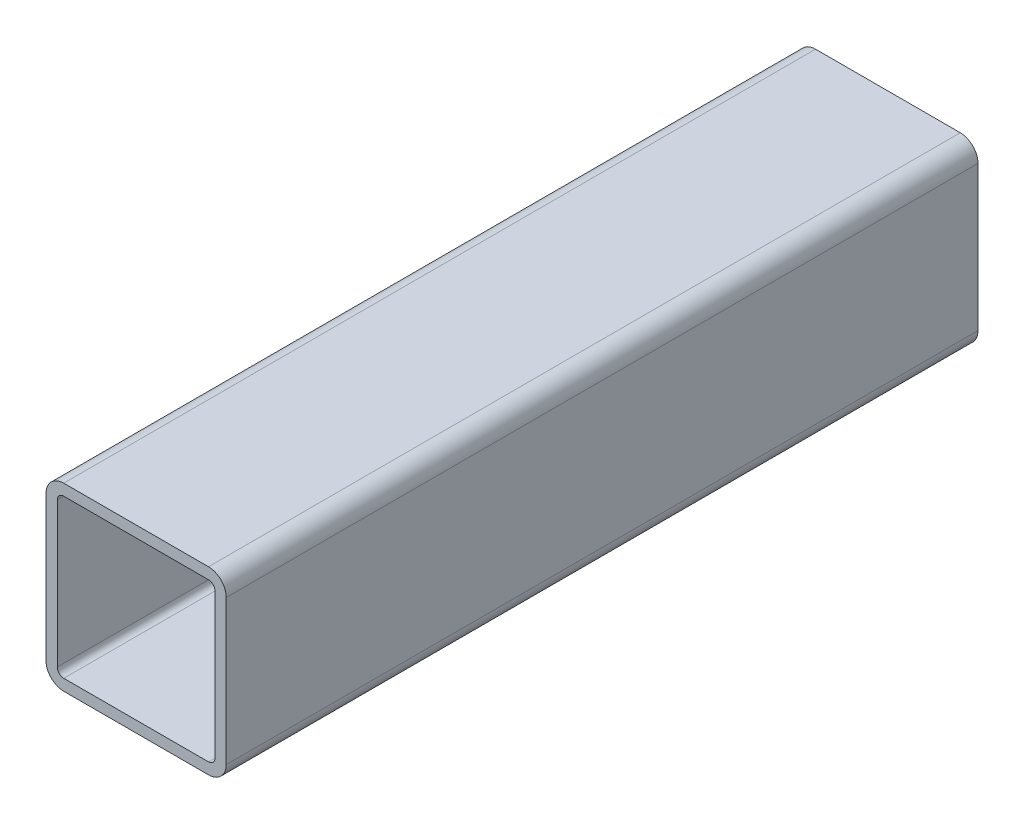
ISO-10303-21;
HEADER;
FILE_DESCRIPTION(('STEP AP214'),'2;1');
FILE_NAME('part.step','',(''),(''),'','','');
FILE_SCHEMA(('AUTOMOTIVE_DESIGN { 1 0 10303 214 1 1 1 1 }'));
ENDSEC;
DATA;
#1=APPLICATION_CONTEXT('core data for automotive mechanical design processes');
#2=APPLICATION_PROTOCOL_DEFINITION('international standard','automotive_design',2000,#1);
#3=PRODUCT_CONTEXT('',#1,'mechanical');
#4=PRODUCT('Part','Part','',(#3));
#5=PRODUCT_RELATED_PRODUCT_CATEGORY('part','',(#4));
#6=PRODUCT_DEFINITION_FORMATION('','',#4);
#7=PRODUCT_DEFINITION_CONTEXT('part definition',#1,'design');
#8=PRODUCT_DEFINITION('design','',#6,#7);
#9=PRODUCT_DEFINITION_SHAPE('','',#8);
#10=(LENGTH_UNIT() NAMED_UNIT(*) SI_UNIT(.MILLI.,.METRE.));
#11=(NAMED_UNIT(*) PLANE_ANGLE_UNIT() SI_UNIT($,.RADIAN.));
#12=(NAMED_UNIT(*) SI_UNIT($,.STERADIAN.) SOLID_ANGLE_UNIT());
#13=UNCERTAINTY_MEASURE_WITH_UNIT(LENGTH_MEASURE(1.E-05),#10,'distance_accuracy_value','');
#14=(GEOMETRIC_REPRESENTATION_CONTEXT(3) GLOBAL_UNCERTAINTY_ASSIGNED_CONTEXT((#13)) GLOBAL_UNIT_ASSIGNED_CONTEXT((#10,
#11,#12)) REPRESENTATION_CONTEXT('',''));
#15=CARTESIAN_POINT('',(0.,0.,0.));
#16=DIRECTION('',(0.,0.,1.));
#17=DIRECTION('',(1.,0.,0.));
#18=AXIS2_PLACEMENT_3D('',#15,#16,#17);
#19=CARTESIAN_POINT('',(-20.4,20.4,211.9));
#20=DIRECTION('',(0.,0.,-1.));
#21=DIRECTION('',(-1.,0.,0.));
#22=AXIS2_PLACEMENT_3D('',#19,#20,#21);
#23=PLANE('',#22);
#24=CARTESIAN_POINT('',(-20.4,20.4,211.9));
#25=DIRECTION('',(0.,0.,1.));
#26=DIRECTION('',(-1.,0.,0.));
#27=AXIS2_PLACEMENT_3D('',#24,#25,#26);
#28=CIRCLE('',#27,5.);
#29=CARTESIAN_POINT('',(-20.4,25.4,211.9));
#30=VERTEX_POINT('',#29);
#31=CARTESIAN_POINT('',(-25.4,20.4,211.9));
#32=VERTEX_POINT('',#31);
#33=EDGE_CURVE('E211',#30,#32,#28,.T.);
#34=ORIENTED_EDGE('',*,*,#33,.T.);
#35=DIRECTION('',(0.,-1.,0.));
#36=VECTOR('',#35,1.);
#37=CARTESIAN_POINT('',(-25.4,-20.4,211.9));
#38=LINE('',#37,#36);
#39=CARTESIAN_POINT('',(-25.4,-20.4,211.9));
#40=VERTEX_POINT('',#39);
#41=EDGE_CURVE('E214',#32,#40,#38,.T.);
#42=ORIENTED_EDGE('',*,*,#41,.T.);
#43=CARTESIAN_POINT('',(-20.4,-20.4,211.9));
#44=DIRECTION('',(0.,0.,1.));
#45=DIRECTION('',(-1.,0.,0.));
#46=AXIS2_PLACEMENT_3D('',#43,#44,#45);
#47=CIRCLE('',#46,5.);
#48=CARTESIAN_POINT('',(-20.4,-25.4,211.9));
#49=VERTEX_POINT('',#48);
#50=EDGE_CURVE('E217',#40,#49,#47,.T.);
#51=ORIENTED_EDGE('',*,*,#50,.T.);
#52=DIRECTION('',(1.,0.,0.));
#53=VECTOR('',#52,1.);
#54=CARTESIAN_POINT('',(20.4,-25.4,211.9));
#55=LINE('',#54,#53);
#56=CARTESIAN_POINT('',(20.4,-25.4,211.9));
#57=VERTEX_POINT('',#56);
#58=EDGE_CURVE('E219',#49,#57,#55,.T.);
#59=ORIENTED_EDGE('',*,*,#58,.T.);
#60=CARTESIAN_POINT('',(20.4,-20.4,211.9));
#61=DIRECTION('',(0.,0.,1.));
#62=DIRECTION('',(-1.,0.,0.));
#63=AXIS2_PLACEMENT_3D('',#60,#61,#62);
#64=CIRCLE('',#63,5.);
#65=CARTESIAN_POINT('',(25.4,-20.4,211.9));
#66=VERTEX_POINT('',#65);
#67=EDGE_CURVE('E221',#57,#66,#64,.T.);
#68=ORIENTED_EDGE('',*,*,#67,.T.);
#69=DIRECTION('',(0.,1.,0.));
#70=VECTOR('',#69,1.);
#71=CARTESIAN_POINT('',(25.4,20.4,211.9));
#72=LINE('',#71,#70);
#73=CARTESIAN_POINT('',(25.4,20.4,211.9));
#74=VERTEX_POINT('',#73);
#75=EDGE_CURVE('E223',#66,#74,#72,.T.);
#76=ORIENTED_EDGE('',*,*,#75,.T.);
#77=CARTESIAN_POINT('',(20.4,20.4,211.9));
#78=DIRECTION('',(0.,0.,1.));
#79=DIRECTION('',(-1.,0.,0.));
#80=AXIS2_PLACEMENT_3D('',#77,#78,#79);
#81=CIRCLE('',#80,5.);
#82=CARTESIAN_POINT('',(20.4,25.4,211.9));
#83=VERTEX_POINT('',#82);
#84=EDGE_CURVE('E225',#74,#83,#81,.T.);
#85=ORIENTED_EDGE('',*,*,#84,.T.);
#86=DIRECTION('',(-1.,0.,0.));
#87=VECTOR('',#86,1.);
#88=CARTESIAN_POINT('',(-20.4,25.4,211.9));
#89=LINE('',#88,#87);
#90=EDGE_CURVE('E227',#83,#30,#89,.T.);
#91=ORIENTED_EDGE('',*,*,#90,.T.);
#92=EDGE_LOOP('',(#34,#42,#51,#59,#68,#76,#85,#91));
#93=FACE_BOUND('',#92,.T.);
#94=CARTESIAN_POINT('',(-20.4,20.4,211.9));
#95=DIRECTION('',(0.,0.,1.));
#96=DIRECTION('',(1.,0.,0.));
#97=AXIS2_PLACEMENT_3D('',#94,#95,#96);
#98=CIRCLE('',#97,1.825);
#99=CARTESIAN_POINT('',(-20.4,22.225,211.9));
#100=VERTEX_POINT('',#99);
#101=CARTESIAN_POINT('',(-22.225,20.4,211.9));
#102=VERTEX_POINT('',#101);
#103=EDGE_CURVE('E146',#100,#102,#98,.T.);
#104=ORIENTED_EDGE('',*,*,#103,.F.);
#105=DIRECTION('',(-1.,0.,0.));
#106=VECTOR('',#105,1.);
#107=CARTESIAN_POINT('',(20.4,22.225,211.9));
#108=LINE('',#107,#106);
#109=CARTESIAN_POINT('',(20.4,22.225,211.9));
#110=VERTEX_POINT('',#109);
#111=EDGE_CURVE('E179',#110,#100,#108,.T.);
#112=ORIENTED_EDGE('',*,*,#111,.F.);
#113=CARTESIAN_POINT('',(20.4,20.4,211.9));
#114=DIRECTION('',(0.,0.,1.));
#115=DIRECTION('',(1.,0.,0.));
#116=AXIS2_PLACEMENT_3D('',#113,#114,#115);
#117=CIRCLE('',#116,1.825);
#118=CARTESIAN_POINT('',(22.225,20.4,211.9));
#119=VERTEX_POINT('',#118);
#120=EDGE_CURVE('E177',#119,#110,#117,.T.);
#121=ORIENTED_EDGE('',*,*,#120,.F.);
#122=DIRECTION('',(0.,1.,0.));
#123=VECTOR('',#122,1.);
#124=CARTESIAN_POINT('',(22.225,-20.4,211.9));
#125=LINE('',#124,#123);
#126=CARTESIAN_POINT('',(22.225,-20.4,211.9));
#127=VERTEX_POINT('',#126);
#128=EDGE_CURVE('E175',#127,#119,#125,.T.);
#129=ORIENTED_EDGE('',*,*,#128,.F.);
#130=CARTESIAN_POINT('',(20.4,-20.4,211.9));
#131=DIRECTION('',(0.,0.,1.));
#132=DIRECTION('',(1.,0.,0.));
#133=AXIS2_PLACEMENT_3D('',#130,#131,#132);
#134=CIRCLE('',#133,1.82500000000001);
#135=CARTESIAN_POINT('',(20.4,-22.225,211.9));
#136=VERTEX_POINT('',#135);
#137=EDGE_CURVE('E173',#136,#127,#134,.T.);
#138=ORIENTED_EDGE('',*,*,#137,.F.);
#139=DIRECTION('',(1.,0.,0.));
#140=VECTOR('',#139,1.);
#141=CARTESIAN_POINT('',(-20.4,-22.225,211.9));
#142=LINE('',#141,#140);
#143=CARTESIAN_POINT('',(-20.4,-22.225,211.9));
#144=VERTEX_POINT('',#143);
#145=EDGE_CURVE('E169',#144,#136,#142,.T.);
#146=ORIENTED_EDGE('',*,*,#145,.F.);
#147=CARTESIAN_POINT('',(-20.4,-20.4,211.9));
#148=DIRECTION('',(0.,0.,1.));
#149=DIRECTION('',(1.,0.,0.));
#150=AXIS2_PLACEMENT_3D('',#147,#148,#149);
#151=CIRCLE('',#150,1.82500000000001);
#152=CARTESIAN_POINT('',(-22.225,-20.4,211.9));
#153=VERTEX_POINT('',#152);
#154=EDGE_CURVE('E167',#153,#144,#151,.T.);
#155=ORIENTED_EDGE('',*,*,#154,.F.);
#156=DIRECTION('',(0.,-1.,0.));
#157=VECTOR('',#156,1.);
#158=CARTESIAN_POINT('',(-22.225,20.4,211.9));
#159=LINE('',#158,#157);
#160=EDGE_CURVE('E154',#102,#153,#159,.T.);
#161=ORIENTED_EDGE('',*,*,#160,.F.);
#162=EDGE_LOOP('',(#104,#112,#121,#129,#138,#146,#155,#161));
#163=FACE_BOUND('',#162,.T.);
#164=ADVANCED_FACE('F33',(#93,#163),#23,.F.);
#165=CARTESIAN_POINT('',(-20.4,20.4,0.));
#166=DIRECTION('',(0.,0.,-1.));
#167=DIRECTION('',(-1.,0.,0.));
#168=AXIS2_PLACEMENT_3D('',#165,#166,#167);
#169=PLANE('',#168);
#170=CARTESIAN_POINT('',(-20.4,20.4,0.));
#171=DIRECTION('',(0.,0.,1.));
#172=DIRECTION('',(-1.,0.,0.));
#173=AXIS2_PLACEMENT_3D('',#170,#171,#172);
#174=CIRCLE('',#173,5.);
#175=CARTESIAN_POINT('',(-20.4,25.4,0.));
#176=VERTEX_POINT('',#175);
#177=CARTESIAN_POINT('',(-25.4,20.4,0.));
#178=VERTEX_POINT('',#177);
#179=EDGE_CURVE('E162',#176,#178,#174,.T.);
#180=ORIENTED_EDGE('',*,*,#179,.F.);
#181=DIRECTION('',(-1.,0.,0.));
#182=VECTOR('',#181,1.);
#183=CARTESIAN_POINT('',(-20.4,25.4,0.));
#184=LINE('',#183,#182);
#185=CARTESIAN_POINT('',(20.4,25.4,0.));
#186=VERTEX_POINT('',#185);
#187=EDGE_CURVE('E215',#186,#176,#184,.T.);
#188=ORIENTED_EDGE('',*,*,#187,.F.);
#189=CARTESIAN_POINT('',(20.4,20.4,0.));
#190=DIRECTION('',(0.,0.,1.));
#191=DIRECTION('',(-1.,0.,0.));
#192=AXIS2_PLACEMENT_3D('',#189,#190,#191);
#193=CIRCLE('',#192,5.);
#194=CARTESIAN_POINT('',(25.4,20.4,0.));
#195=VERTEX_POINT('',#194);
#196=EDGE_CURVE('E242',#195,#186,#193,.T.);
#197=ORIENTED_EDGE('',*,*,#196,.F.);
#198=DIRECTION('',(0.,1.,0.));
#199=VECTOR('',#198,1.);
#200=CARTESIAN_POINT('',(25.4,20.4,0.));
#201=LINE('',#200,#199);
#202=CARTESIAN_POINT('',(25.4,-20.4,0.));
#203=VERTEX_POINT('',#202);
#204=EDGE_CURVE('E240',#203,#195,#201,.T.);
#205=ORIENTED_EDGE('',*,*,#204,.F.);
#206=CARTESIAN_POINT('',(20.4,-20.4,0.));
#207=DIRECTION('',(0.,0.,1.));
#208=DIRECTION('',(-1.,0.,0.));
#209=AXIS2_PLACEMENT_3D('',#206,#207,#208);
#210=CIRCLE('',#209,5.);
#211=CARTESIAN_POINT('',(20.4,-25.4,0.));
#212=VERTEX_POINT('',#211);
#213=EDGE_CURVE('E238',#212,#203,#210,.T.);
#214=ORIENTED_EDGE('',*,*,#213,.F.);
#215=DIRECTION('',(1.,0.,0.));
#216=VECTOR('',#215,1.);
#217=CARTESIAN_POINT('',(20.4,-25.4,0.));
#218=LINE('',#217,#216);
#219=CARTESIAN_POINT('',(-20.4,-25.4,0.));
#220=VERTEX_POINT('',#219);
#221=EDGE_CURVE('E236',#220,#212,#218,.T.);
#222=ORIENTED_EDGE('',*,*,#221,.F.);
#223=CARTESIAN_POINT('',(-20.4,-20.4,0.));
#224=DIRECTION('',(0.,0.,1.));
#225=DIRECTION('',(-1.,0.,0.));
#226=AXIS2_PLACEMENT_3D('',#223,#224,#225);
#227=CIRCLE('',#226,5.);
#228=CARTESIAN_POINT('',(-25.4,-20.4,0.));
#229=VERTEX_POINT('',#228);
#230=EDGE_CURVE('E234',#229,#220,#227,.T.);
#231=ORIENTED_EDGE('',*,*,#230,.F.);
#232=DIRECTION('',(0.,-1.,0.));
#233=VECTOR('',#232,1.);
#234=CARTESIAN_POINT('',(-25.4,-20.4,0.));
#235=LINE('',#234,#233);
#236=EDGE_CURVE('E232',#178,#229,#235,.T.);
#237=ORIENTED_EDGE('',*,*,#236,.F.);
#238=EDGE_LOOP('',(#180,#188,#197,#205,#214,#222,#231,#237));
#239=FACE_BOUND('',#238,.T.);
#240=DIRECTION('',(-1.,0.,0.));
#241=VECTOR('',#240,1.);
#242=CARTESIAN_POINT('',(20.4,22.225,0.));
#243=LINE('',#242,#241);
#244=CARTESIAN_POINT('',(20.4,22.225,0.));
#245=VERTEX_POINT('',#244);
#246=CARTESIAN_POINT('',(-20.4,22.225,0.));
#247=VERTEX_POINT('',#246);
#248=EDGE_CURVE('E155',#245,#247,#243,.T.);
#249=ORIENTED_EDGE('',*,*,#248,.T.);
#250=CARTESIAN_POINT('',(-20.4,20.4,0.));
#251=DIRECTION('',(0.,0.,1.));
#252=DIRECTION('',(1.,0.,0.));
#253=AXIS2_PLACEMENT_3D('',#250,#251,#252);
#254=CIRCLE('',#253,1.825);
#255=CARTESIAN_POINT('',(-22.225,20.4,0.));
#256=VERTEX_POINT('',#255);
#257=EDGE_CURVE('E56',#247,#256,#254,.T.);
#258=ORIENTED_EDGE('',*,*,#257,.T.);
#259=DIRECTION('',(0.,-1.,0.));
#260=VECTOR('',#259,1.);
#261=CARTESIAN_POINT('',(-22.225,20.4,0.));
#262=LINE('',#261,#260);
#263=CARTESIAN_POINT('',(-22.225,-20.4,0.));
#264=VERTEX_POINT('',#263);
#265=EDGE_CURVE('E161',#256,#264,#262,.T.);
#266=ORIENTED_EDGE('',*,*,#265,.T.);
#267=CARTESIAN_POINT('',(-20.4,-20.4,0.));
#268=DIRECTION('',(0.,0.,1.));
#269=DIRECTION('',(1.,0.,0.));
#270=AXIS2_PLACEMENT_3D('',#267,#268,#269);
#271=CIRCLE('',#270,1.82500000000001);
#272=CARTESIAN_POINT('',(-20.4,-22.225,0.));
#273=VERTEX_POINT('',#272);
#274=EDGE_CURVE('E183',#264,#273,#271,.T.);
#275=ORIENTED_EDGE('',*,*,#274,.T.);
#276=DIRECTION('',(1.,0.,0.));
#277=VECTOR('',#276,1.);
#278=CARTESIAN_POINT('',(-20.4,-22.225,0.));
#279=LINE('',#278,#277);
#280=CARTESIAN_POINT('',(20.4,-22.225,0.));
#281=VERTEX_POINT('',#280);
#282=EDGE_CURVE('E186',#273,#281,#279,.T.);
#283=ORIENTED_EDGE('',*,*,#282,.T.);
#284=CARTESIAN_POINT('',(20.4,-20.4,0.));
#285=DIRECTION('',(0.,0.,1.));
#286=DIRECTION('',(1.,0.,0.));
#287=AXIS2_PLACEMENT_3D('',#284,#285,#286);
#288=CIRCLE('',#287,1.82500000000001);
#289=CARTESIAN_POINT('',(22.225,-20.4,0.));
#290=VERTEX_POINT('',#289);
#291=EDGE_CURVE('E189',#281,#290,#288,.T.);
#292=ORIENTED_EDGE('',*,*,#291,.T.);
#293=DIRECTION('',(0.,1.,0.));
#294=VECTOR('',#293,1.);
#295=CARTESIAN_POINT('',(22.225,-20.4,0.));
#296=LINE('',#295,#294);
#297=CARTESIAN_POINT('',(22.225,20.4,0.));
#298=VERTEX_POINT('',#297);
#299=EDGE_CURVE('E192',#290,#298,#296,.T.);
#300=ORIENTED_EDGE('',*,*,#299,.T.);
#301=CARTESIAN_POINT('',(20.4,20.4,0.));
#302=DIRECTION('',(0.,0.,1.));
#303=DIRECTION('',(1.,0.,0.));
#304=AXIS2_PLACEMENT_3D('',#301,#302,#303);
#305=CIRCLE('',#304,1.825);
#306=EDGE_CURVE('E195',#298,#245,#305,.T.);
#307=ORIENTED_EDGE('',*,*,#306,.T.);
#308=EDGE_LOOP('',(#249,#258,#266,#275,#283,#292,#300,#307));
#309=FACE_BOUND('',#308,.T.);
#310=ADVANCED_FACE('F272',(#239,#309),#169,.T.);
#311=CARTESIAN_POINT('',(-20.4,20.4,211.9));
#312=DIRECTION('',(0.,0.,-1.));
#313=DIRECTION('',(-1.,0.,0.));
#314=AXIS2_PLACEMENT_3D('',#311,#312,#313);
#315=CYLINDRICAL_SURFACE('',#314,5.);
#316=ORIENTED_EDGE('',*,*,#179,.T.);
#317=DIRECTION('',(0.,0.,-1.));
#318=VECTOR('',#317,1.);
#319=CARTESIAN_POINT('',(-25.4,20.4,211.9));
#320=LINE('',#319,#318);
#321=EDGE_CURVE('E11',#32,#178,#320,.T.);
#322=ORIENTED_EDGE('',*,*,#321,.F.);
#323=ORIENTED_EDGE('',*,*,#33,.F.);
#324=DIRECTION('',(0.,0.,-1.));
#325=VECTOR('',#324,1.);
#326=CARTESIAN_POINT('',(-20.4,25.4,211.9));
#327=LINE('',#326,#325);
#328=EDGE_CURVE('E229',#30,#176,#327,.T.);
#329=ORIENTED_EDGE('',*,*,#328,.T.);
#330=EDGE_LOOP('',(#316,#322,#323,#329));
#331=FACE_BOUND('',#330,.T.);
#332=ADVANCED_FACE('F35',(#331),#315,.T.);
#333=CARTESIAN_POINT('',(-25.4,-20.4,211.9));
#334=DIRECTION('',(1.,0.,0.));
#335=DIRECTION('',(0.,0.,-1.));
#336=AXIS2_PLACEMENT_3D('',#333,#334,#335);
#337=PLANE('',#336);
#338=ORIENTED_EDGE('',*,*,#236,.T.);
#339=DIRECTION('',(0.,0.,-1.));
#340=VECTOR('',#339,1.);
#341=CARTESIAN_POINT('',(-25.4,-20.4,211.9));
#342=LINE('',#341,#340);
#343=EDGE_CURVE('E41',#40,#229,#342,.T.);
#344=ORIENTED_EDGE('',*,*,#343,.F.);
#345=ORIENTED_EDGE('',*,*,#41,.F.);
#346=ORIENTED_EDGE('',*,*,#321,.T.);
#347=EDGE_LOOP('',(#338,#344,#345,#346));
#348=FACE_BOUND('',#347,.T.);
#349=ADVANCED_FACE('F289',(#348),#337,.F.);
#350=CARTESIAN_POINT('',(-20.4,-20.4,211.9));
#351=DIRECTION('',(0.,0.,-1.));
#352=DIRECTION('',(-1.,0.,0.));
#353=AXIS2_PLACEMENT_3D('',#350,#351,#352);
#354=CYLINDRICAL_SURFACE('',#353,5.);
#355=ORIENTED_EDGE('',*,*,#230,.T.);
#356=DIRECTION('',(0.,0.,-1.));
#357=VECTOR('',#356,1.);
#358=CARTESIAN_POINT('',(-20.4,-25.4,211.9));
#359=LINE('',#358,#357);
#360=EDGE_CURVE('E259',#49,#220,#359,.T.);
#361=ORIENTED_EDGE('',*,*,#360,.F.);
#362=ORIENTED_EDGE('',*,*,#50,.F.);
#363=ORIENTED_EDGE('',*,*,#343,.T.);
#364=EDGE_LOOP('',(#355,#361,#362,#363));
#365=FACE_BOUND('',#364,.T.);
#366=ADVANCED_FACE('F266',(#365),#354,.T.);
#367=CARTESIAN_POINT('',(20.4,-25.4,211.9));
#368=DIRECTION('',(0.,1.,0.));
#369=DIRECTION('',(0.,0.,1.));
#370=AXIS2_PLACEMENT_3D('',#367,#368,#369);
#371=PLANE('',#370);
#372=ORIENTED_EDGE('',*,*,#221,.T.);
#373=DIRECTION('',(0.,0.,-1.));
#374=VECTOR('',#373,1.);
#375=CARTESIAN_POINT('',(20.4,-25.4,211.9));
#376=LINE('',#375,#374);
#377=EDGE_CURVE('E256',#57,#212,#376,.T.);
#378=ORIENTED_EDGE('',*,*,#377,.F.);
#379=ORIENTED_EDGE('',*,*,#58,.F.);
#380=ORIENTED_EDGE('',*,*,#360,.T.);
#381=EDGE_LOOP('',(#372,#378,#379,#380));
#382=FACE_BOUND('',#381,.T.);
#383=ADVANCED_FACE('F278',(#382),#371,.F.);
#384=CARTESIAN_POINT('',(20.4,-20.4,211.9));
#385=DIRECTION('',(0.,0.,-1.));
#386=DIRECTION('',(-1.,0.,0.));
#387=AXIS2_PLACEMENT_3D('',#384,#385,#386);
#388=CYLINDRICAL_SURFACE('',#387,5.);
#389=ORIENTED_EDGE('',*,*,#213,.T.);
#390=DIRECTION('',(0.,0.,-1.));
#391=VECTOR('',#390,1.);
#392=CARTESIAN_POINT('',(25.4,-20.4,211.9));
#393=LINE('',#392,#391);
#394=EDGE_CURVE('E253',#66,#203,#393,.T.);
#395=ORIENTED_EDGE('',*,*,#394,.F.);
#396=ORIENTED_EDGE('',*,*,#67,.F.);
#397=ORIENTED_EDGE('',*,*,#377,.T.);
#398=EDGE_LOOP('',(#389,#395,#396,#397));
#399=FACE_BOUND('',#398,.T.);
#400=ADVANCED_FACE('F282',(#399),#388,.T.);
#401=CARTESIAN_POINT('',(25.4,20.4,211.9));
#402=DIRECTION('',(-1.,0.,0.));
#403=DIRECTION('',(0.,-1.,0.));
#404=AXIS2_PLACEMENT_3D('',#401,#402,#403);
#405=PLANE('',#404);
#406=ORIENTED_EDGE('',*,*,#204,.T.);
#407=DIRECTION('',(0.,0.,-1.));
#408=VECTOR('',#407,1.);
#409=CARTESIAN_POINT('',(25.4,20.4,211.9));
#410=LINE('',#409,#408);
#411=EDGE_CURVE('E250',#74,#195,#410,.T.);
#412=ORIENTED_EDGE('',*,*,#411,.F.);
#413=ORIENTED_EDGE('',*,*,#75,.F.);
#414=ORIENTED_EDGE('',*,*,#394,.T.);
#415=EDGE_LOOP('',(#406,#412,#413,#414));
#416=FACE_BOUND('',#415,.T.);
#417=ADVANCED_FACE('F302',(#416),#405,.F.);
#418=CARTESIAN_POINT('',(20.4,20.4,211.9));
#419=DIRECTION('',(0.,0.,-1.));
#420=DIRECTION('',(-1.,0.,0.));
#421=AXIS2_PLACEMENT_3D('',#418,#419,#420);
#422=CYLINDRICAL_SURFACE('',#421,5.);
#423=ORIENTED_EDGE('',*,*,#196,.T.);
#424=DIRECTION('',(0.,0.,-1.));
#425=VECTOR('',#424,1.);
#426=CARTESIAN_POINT('',(20.4,25.4,211.9));
#427=LINE('',#426,#425);
#428=EDGE_CURVE('E247',#83,#186,#427,.T.);
#429=ORIENTED_EDGE('',*,*,#428,.F.);
#430=ORIENTED_EDGE('',*,*,#84,.F.);
#431=ORIENTED_EDGE('',*,*,#411,.T.);
#432=EDGE_LOOP('',(#423,#429,#430,#431));
#433=FACE_BOUND('',#432,.T.);
#434=ADVANCED_FACE('F300',(#433),#422,.T.);
#435=CARTESIAN_POINT('',(-20.4,25.4,211.9));
#436=DIRECTION('',(0.,-1.,0.));
#437=DIRECTION('',(0.,0.,-1.));
#438=AXIS2_PLACEMENT_3D('',#435,#436,#437);
#439=PLANE('',#438);
#440=ORIENTED_EDGE('',*,*,#187,.T.);
#441=ORIENTED_EDGE('',*,*,#328,.F.);
#442=ORIENTED_EDGE('',*,*,#90,.F.);
#443=ORIENTED_EDGE('',*,*,#428,.T.);
#444=EDGE_LOOP('',(#440,#441,#442,#443));
#445=FACE_BOUND('',#444,.T.);
#446=ADVANCED_FACE('F295',(#445),#439,.F.);
#447=CARTESIAN_POINT('',(-20.4,20.4,211.9));
#448=DIRECTION('',(0.,0.,-1.));
#449=DIRECTION('',(-1.,0.,0.));
#450=AXIS2_PLACEMENT_3D('',#447,#448,#449);
#451=CYLINDRICAL_SURFACE('',#450,1.825);
#452=ORIENTED_EDGE('',*,*,#257,.F.);
#453=DIRECTION('',(0.,0.,-1.));
#454=VECTOR('',#453,1.);
#455=CARTESIAN_POINT('',(-20.4,22.225,211.9));
#456=LINE('',#455,#454);
#457=EDGE_CURVE('E150',#100,#247,#456,.T.);
#458=ORIENTED_EDGE('',*,*,#457,.F.);
#459=ORIENTED_EDGE('',*,*,#103,.T.);
#460=DIRECTION('',(0.,0.,-1.));
#461=VECTOR('',#460,1.);
#462=CARTESIAN_POINT('',(-22.225,20.4,211.9));
#463=LINE('',#462,#461);
#464=EDGE_CURVE('E149',#102,#256,#463,.T.);
#465=ORIENTED_EDGE('',*,*,#464,.T.);
#466=EDGE_LOOP('',(#452,#458,#459,#465));
#467=FACE_BOUND('',#466,.T.);
#468=ADVANCED_FACE('F148',(#467),#451,.F.);
#469=CARTESIAN_POINT('',(-22.225,20.4,211.9));
#470=DIRECTION('',(1.,0.,0.));
#471=DIRECTION('',(0.,0.,-1.));
#472=AXIS2_PLACEMENT_3D('',#469,#470,#471);
#473=PLANE('',#472);
#474=ORIENTED_EDGE('',*,*,#265,.F.);
#475=ORIENTED_EDGE('',*,*,#464,.F.);
#476=ORIENTED_EDGE('',*,*,#160,.T.);
#477=DIRECTION('',(0.,0.,-1.));
#478=VECTOR('',#477,1.);
#479=CARTESIAN_POINT('',(-22.225,-20.4,211.9));
#480=LINE('',#479,#478);
#481=EDGE_CURVE('E163',#153,#264,#480,.T.);
#482=ORIENTED_EDGE('',*,*,#481,.T.);
#483=EDGE_LOOP('',(#474,#475,#476,#482));
#484=FACE_BOUND('',#483,.T.);
#485=ADVANCED_FACE('F158',(#484),#473,.T.);
#486=CARTESIAN_POINT('',(-20.4,-20.4,211.9));
#487=DIRECTION('',(0.,0.,-1.));
#488=DIRECTION('',(-1.,0.,0.));
#489=AXIS2_PLACEMENT_3D('',#486,#487,#488);
#490=CYLINDRICAL_SURFACE('',#489,1.82500000000001);
#491=ORIENTED_EDGE('',*,*,#274,.F.);
#492=ORIENTED_EDGE('',*,*,#481,.F.);
#493=ORIENTED_EDGE('',*,*,#154,.T.);
#494=DIRECTION('',(0.,0.,-1.));
#495=VECTOR('',#494,1.);
#496=CARTESIAN_POINT('',(-20.4,-22.225,211.9));
#497=LINE('',#496,#495);
#498=EDGE_CURVE('E208',#144,#273,#497,.T.);
#499=ORIENTED_EDGE('',*,*,#498,.T.);
#500=EDGE_LOOP('',(#491,#492,#493,#499));
#501=FACE_BOUND('',#500,.T.);
#502=ADVANCED_FACE('F327',(#501),#490,.F.);
#503=CARTESIAN_POINT('',(-20.4,-22.225,211.9));
#504=DIRECTION('',(0.,1.,0.));
#505=DIRECTION('',(0.,0.,1.));
#506=AXIS2_PLACEMENT_3D('',#503,#504,#505);
#507=PLANE('',#506);
#508=ORIENTED_EDGE('',*,*,#282,.F.);
#509=ORIENTED_EDGE('',*,*,#498,.F.);
#510=ORIENTED_EDGE('',*,*,#145,.T.);
#511=DIRECTION('',(0.,0.,-1.));
#512=VECTOR('',#511,1.);
#513=CARTESIAN_POINT('',(20.4,-22.225,211.9));
#514=LINE('',#513,#512);
#515=EDGE_CURVE('E206',#136,#281,#514,.T.);
#516=ORIENTED_EDGE('',*,*,#515,.T.);
#517=EDGE_LOOP('',(#508,#509,#510,#516));
#518=FACE_BOUND('',#517,.T.);
#519=ADVANCED_FACE('F331',(#518),#507,.T.);
#520=CARTESIAN_POINT('',(20.4,-20.4,211.9));
#521=DIRECTION('',(0.,0.,-1.));
#522=DIRECTION('',(-1.,0.,0.));
#523=AXIS2_PLACEMENT_3D('',#520,#521,#522);
#524=CYLINDRICAL_SURFACE('',#523,1.82500000000001);
#525=ORIENTED_EDGE('',*,*,#291,.F.);
#526=ORIENTED_EDGE('',*,*,#515,.F.);
#527=ORIENTED_EDGE('',*,*,#137,.T.);
#528=DIRECTION('',(0.,0.,-1.));
#529=VECTOR('',#528,1.);
#530=CARTESIAN_POINT('',(22.225,-20.4,211.9));
#531=LINE('',#530,#529);
#532=EDGE_CURVE('E204',#127,#290,#531,.T.);
#533=ORIENTED_EDGE('',*,*,#532,.T.);
#534=EDGE_LOOP('',(#525,#526,#527,#533));
#535=FACE_BOUND('',#534,.T.);
#536=ADVANCED_FACE('F337',(#535),#524,.F.);
#537=CARTESIAN_POINT('',(22.225,-20.4,211.9));
#538=DIRECTION('',(-1.,0.,0.));
#539=DIRECTION('',(0.,0.,1.));
#540=AXIS2_PLACEMENT_3D('',#537,#538,#539);
#541=PLANE('',#540);
#542=ORIENTED_EDGE('',*,*,#299,.F.);
#543=ORIENTED_EDGE('',*,*,#532,.F.);
#544=ORIENTED_EDGE('',*,*,#128,.T.);
#545=DIRECTION('',(0.,0.,-1.));
#546=VECTOR('',#545,1.);
#547=CARTESIAN_POINT('',(22.225,20.4,211.9));
#548=LINE('',#547,#546);
#549=EDGE_CURVE('E202',#119,#298,#548,.T.);
#550=ORIENTED_EDGE('',*,*,#549,.T.);
#551=EDGE_LOOP('',(#542,#543,#544,#550));
#552=FACE_BOUND('',#551,.T.);
#553=ADVANCED_FACE('F341',(#552),#541,.T.);
#554=CARTESIAN_POINT('',(20.4,20.4,211.9));
#555=DIRECTION('',(0.,0.,-1.));
#556=DIRECTION('',(-1.,0.,0.));
#557=AXIS2_PLACEMENT_3D('',#554,#555,#556);
#558=CYLINDRICAL_SURFACE('',#557,1.825);
#559=ORIENTED_EDGE('',*,*,#306,.F.);
#560=ORIENTED_EDGE('',*,*,#549,.F.);
#561=ORIENTED_EDGE('',*,*,#120,.T.);
#562=DIRECTION('',(0.,0.,-1.));
#563=VECTOR('',#562,1.);
#564=CARTESIAN_POINT('',(20.4,22.225,211.9));
#565=LINE('',#564,#563);
#566=EDGE_CURVE('E48',#110,#245,#565,.T.);
#567=ORIENTED_EDGE('',*,*,#566,.T.);
#568=EDGE_LOOP('',(#559,#560,#561,#567));
#569=FACE_BOUND('',#568,.T.);
#570=ADVANCED_FACE('F345',(#569),#558,.F.);
#571=CARTESIAN_POINT('',(20.4,22.225,211.9));
#572=DIRECTION('',(0.,-1.,0.));
#573=DIRECTION('',(0.,0.,-1.));
#574=AXIS2_PLACEMENT_3D('',#571,#572,#573);
#575=PLANE('',#574);
#576=ORIENTED_EDGE('',*,*,#248,.F.);
#577=ORIENTED_EDGE('',*,*,#566,.F.);
#578=ORIENTED_EDGE('',*,*,#111,.T.);
#579=ORIENTED_EDGE('',*,*,#457,.T.);
#580=EDGE_LOOP('',(#576,#577,#578,#579));
#581=FACE_BOUND('',#580,.T.);
#582=ADVANCED_FACE('F349',(#581),#575,.T.);
#583=CLOSED_SHELL('',(#164,#310,#332,#349,#366,#383,#400,#417,#434,#446,#468,#485,#502,#519,
#536,#553,#570,#582));
#584=MANIFOLD_SOLID_BREP('B2',#583);
#585=ADVANCED_BREP_SHAPE_REPRESENTATION('',(#18,#584),#14);
#586=SHAPE_DEFINITION_REPRESENTATION(#9,#585);
ENDSEC;
END-ISO-10303-21;
